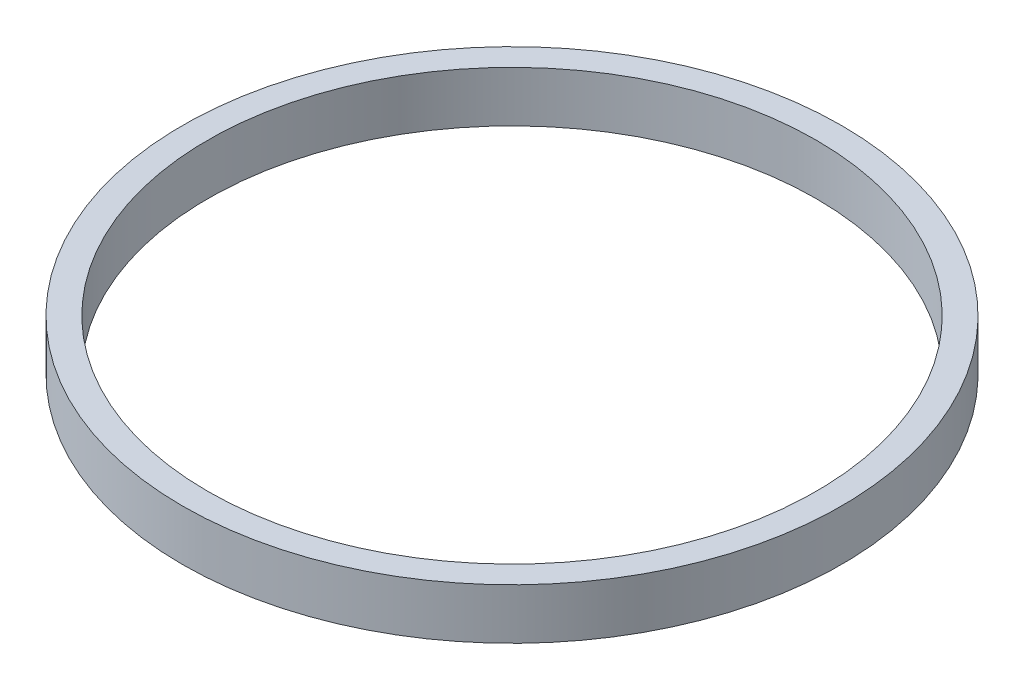
ISO-10303-21;
HEADER;
FILE_DESCRIPTION(('STEP AP214'),'2;1');
FILE_NAME('part.step','',(''),(''),'','','');
FILE_SCHEMA(('AUTOMOTIVE_DESIGN { 1 0 10303 214 1 1 1 1 }'));
ENDSEC;
DATA;
#1=APPLICATION_CONTEXT('core data for automotive mechanical design processes');
#2=APPLICATION_PROTOCOL_DEFINITION('international standard','automotive_design',2000,#1);
#3=PRODUCT_CONTEXT('',#1,'mechanical');
#4=PRODUCT('Part','Part','',(#3));
#5=PRODUCT_RELATED_PRODUCT_CATEGORY('part','',(#4));
#6=PRODUCT_DEFINITION_FORMATION('','',#4);
#7=PRODUCT_DEFINITION_CONTEXT('part definition',#1,'design');
#8=PRODUCT_DEFINITION('design','',#6,#7);
#9=PRODUCT_DEFINITION_SHAPE('','',#8);
#10=(LENGTH_UNIT() NAMED_UNIT(*) SI_UNIT(.MILLI.,.METRE.));
#11=(NAMED_UNIT(*) PLANE_ANGLE_UNIT() SI_UNIT($,.RADIAN.));
#12=(NAMED_UNIT(*) SI_UNIT($,.STERADIAN.) SOLID_ANGLE_UNIT());
#13=UNCERTAINTY_MEASURE_WITH_UNIT(LENGTH_MEASURE(1.E-05),#10,'distance_accuracy_value','');
#14=(GEOMETRIC_REPRESENTATION_CONTEXT(3) GLOBAL_UNCERTAINTY_ASSIGNED_CONTEXT((#13)) GLOBAL_UNIT_ASSIGNED_CONTEXT((#10,
#11,#12)) REPRESENTATION_CONTEXT('',''));
#15=CARTESIAN_POINT('',(0.,0.,0.));
#16=DIRECTION('',(0.,0.,1.));
#17=DIRECTION('',(1.,0.,0.));
#18=AXIS2_PLACEMENT_3D('',#15,#16,#17);
#19=CARTESIAN_POINT('',(0.,1.,0.));
#20=DIRECTION('',(0.,1.,0.));
#21=DIRECTION('',(0.,0.,1.));
#22=AXIS2_PLACEMENT_3D('',#19,#20,#21);
#23=PLANE('',#22);
#24=CARTESIAN_POINT('',(0.,1.,0.));
#25=DIRECTION('',(0.,1.,0.));
#26=DIRECTION('',(0.,0.,1.));
#27=AXIS2_PLACEMENT_3D('',#24,#25,#26);
#28=CIRCLE('',#27,6.5);
#29=CARTESIAN_POINT('',(0.,1.,6.5));
#30=VERTEX_POINT('',#29);
#31=EDGE_CURVE('E11',#30,#30,#28,.T.);
#32=ORIENTED_EDGE('',*,*,#31,.T.);
#33=EDGE_LOOP('',(#32));
#34=FACE_BOUND('',#33,.T.);
#35=CARTESIAN_POINT('',(0.,1.,0.));
#36=DIRECTION('',(0.,1.,0.));
#37=DIRECTION('',(0.,0.,1.));
#38=AXIS2_PLACEMENT_3D('',#35,#36,#37);
#39=CIRCLE('',#38,6.);
#40=CARTESIAN_POINT('',(0.,1.,6.));
#41=VERTEX_POINT('',#40);
#42=EDGE_CURVE('E47',#41,#41,#39,.T.);
#43=ORIENTED_EDGE('',*,*,#42,.F.);
#44=EDGE_LOOP('',(#43));
#45=FACE_BOUND('',#44,.T.);
#46=ADVANCED_FACE('F34',(#34,#45),#23,.T.);
#47=CARTESIAN_POINT('',(0.,0.,0.));
#48=DIRECTION('',(0.,1.,0.));
#49=DIRECTION('',(0.,0.,1.));
#50=AXIS2_PLACEMENT_3D('',#47,#48,#49);
#51=PLANE('',#50);
#52=CARTESIAN_POINT('',(0.,0.,0.));
#53=DIRECTION('',(0.,1.,0.));
#54=DIRECTION('',(0.,0.,1.));
#55=AXIS2_PLACEMENT_3D('',#52,#53,#54);
#56=CIRCLE('',#55,6.5);
#57=CARTESIAN_POINT('',(0.,0.,6.5));
#58=VERTEX_POINT('',#57);
#59=EDGE_CURVE('E38',#58,#58,#56,.T.);
#60=ORIENTED_EDGE('',*,*,#59,.F.);
#61=EDGE_LOOP('',(#60));
#62=FACE_BOUND('',#61,.T.);
#63=CARTESIAN_POINT('',(0.,0.,0.));
#64=DIRECTION('',(0.,1.,0.));
#65=DIRECTION('',(0.,0.,1.));
#66=AXIS2_PLACEMENT_3D('',#63,#64,#65);
#67=CIRCLE('',#66,6.);
#68=CARTESIAN_POINT('',(0.,0.,6.));
#69=VERTEX_POINT('',#68);
#70=EDGE_CURVE('E50',#69,#69,#67,.T.);
#71=ORIENTED_EDGE('',*,*,#70,.T.);
#72=EDGE_LOOP('',(#71));
#73=FACE_BOUND('',#72,.T.);
#74=ADVANCED_FACE('F60',(#62,#73),#51,.F.);
#75=CARTESIAN_POINT('',(0.,1.,0.));
#76=DIRECTION('',(0.,-1.,0.));
#77=DIRECTION('',(0.,0.,-1.));
#78=AXIS2_PLACEMENT_3D('',#75,#76,#77);
#79=CYLINDRICAL_SURFACE('',#78,6.5);
#80=ORIENTED_EDGE('',*,*,#31,.F.);
#81=EDGE_LOOP('',(#80));
#82=FACE_BOUND('',#81,.T.);
#83=ORIENTED_EDGE('',*,*,#59,.T.);
#84=EDGE_LOOP('',(#83));
#85=FACE_BOUND('',#84,.T.);
#86=ADVANCED_FACE('F36',(#82,#85),#79,.T.);
#87=CARTESIAN_POINT('',(0.,1.,0.));
#88=DIRECTION('',(0.,-1.,0.));
#89=DIRECTION('',(0.,0.,-1.));
#90=AXIS2_PLACEMENT_3D('',#87,#88,#89);
#91=CYLINDRICAL_SURFACE('',#90,6.);
#92=ORIENTED_EDGE('',*,*,#42,.T.);
#93=EDGE_LOOP('',(#92));
#94=FACE_BOUND('',#93,.T.);
#95=ORIENTED_EDGE('',*,*,#70,.F.);
#96=EDGE_LOOP('',(#95));
#97=FACE_BOUND('',#96,.T.);
#98=ADVANCED_FACE('F56',(#94,#97),#91,.F.);
#99=CLOSED_SHELL('',(#46,#74,#86,#98));
#100=MANIFOLD_SOLID_BREP('B2',#99);
#101=ADVANCED_BREP_SHAPE_REPRESENTATION('',(#18,#100),#14);
#102=SHAPE_DEFINITION_REPRESENTATION(#9,#101);
ENDSEC;
END-ISO-10303-21;
